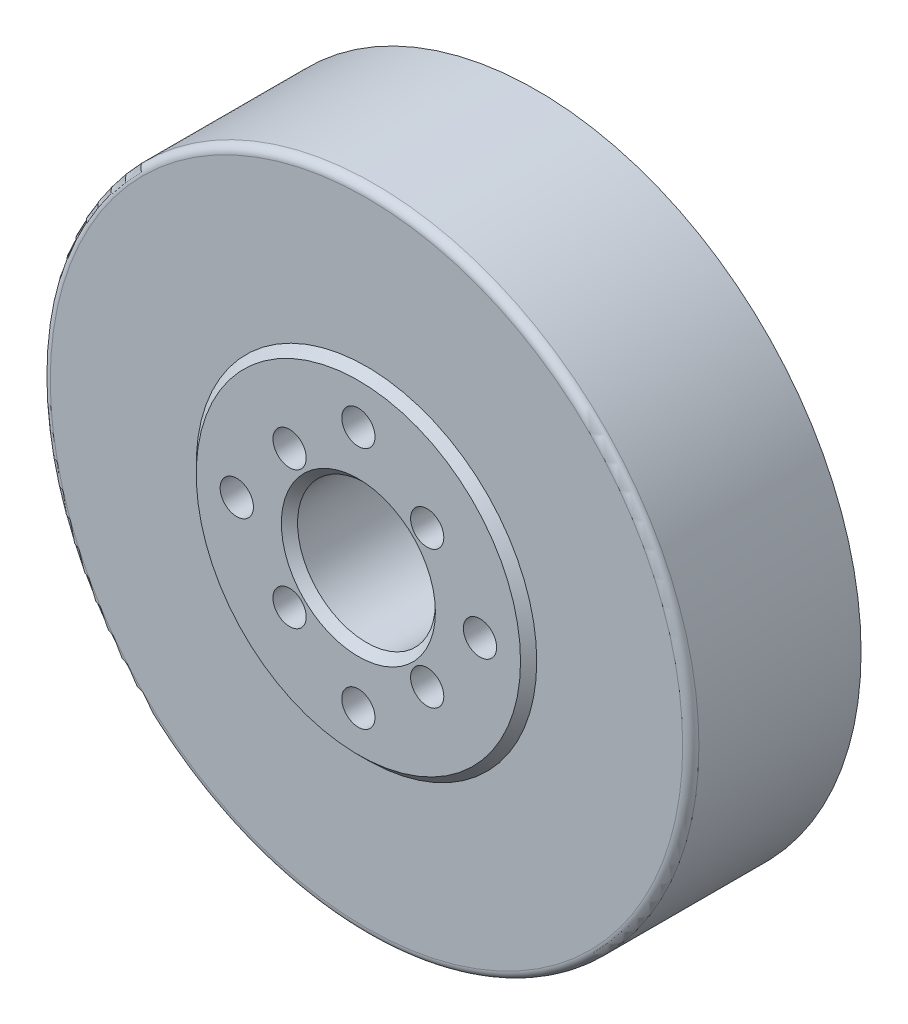
ISO-10303-21;
HEADER;
FILE_DESCRIPTION(('STEP AP214'),'2;1');
FILE_NAME('part.step','',(''),(''),'','','');
FILE_SCHEMA(('AUTOMOTIVE_DESIGN { 1 0 10303 214 1 1 1 1 }'));
ENDSEC;
DATA;
#1=APPLICATION_CONTEXT('core data for automotive mechanical design processes');
#2=APPLICATION_PROTOCOL_DEFINITION('international standard','automotive_design',2000,#1);
#3=PRODUCT_CONTEXT('',#1,'mechanical');
#4=PRODUCT('Part','Part','',(#3));
#5=PRODUCT_RELATED_PRODUCT_CATEGORY('part','',(#4));
#6=PRODUCT_DEFINITION_FORMATION('','',#4);
#7=PRODUCT_DEFINITION_CONTEXT('part definition',#1,'design');
#8=PRODUCT_DEFINITION('design','',#6,#7);
#9=PRODUCT_DEFINITION_SHAPE('','',#8);
#10=(LENGTH_UNIT() NAMED_UNIT(*) SI_UNIT(.MILLI.,.METRE.));
#11=(NAMED_UNIT(*) PLANE_ANGLE_UNIT() SI_UNIT($,.RADIAN.));
#12=(NAMED_UNIT(*) SI_UNIT($,.STERADIAN.) SOLID_ANGLE_UNIT());
#13=UNCERTAINTY_MEASURE_WITH_UNIT(LENGTH_MEASURE(1.E-05),#10,'distance_accuracy_value','');
#14=(GEOMETRIC_REPRESENTATION_CONTEXT(3) GLOBAL_UNCERTAINTY_ASSIGNED_CONTEXT((#13)) GLOBAL_UNIT_ASSIGNED_CONTEXT((#10,
#11,#12)) REPRESENTATION_CONTEXT('',''));
#15=CARTESIAN_POINT('',(0.,0.,0.));
#16=DIRECTION('',(0.,0.,1.));
#17=DIRECTION('',(1.,0.,0.));
#18=AXIS2_PLACEMENT_3D('',#15,#16,#17);
#19=CARTESIAN_POINT('',(0.,0.,10.5));
#20=DIRECTION('',(0.,0.,-1.));
#21=DIRECTION('',(-1.,0.,0.));
#22=AXIS2_PLACEMENT_3D('',#19,#20,#21);
#23=CYLINDRICAL_SURFACE('',#22,20.);
#24=CARTESIAN_POINT('',(0.,0.,10.));
#25=DIRECTION('',(0.,0.,1.));
#26=DIRECTION('',(1.,0.,0.));
#27=AXIS2_PLACEMENT_3D('',#24,#25,#26);
#28=CIRCLE('',#27,20.);
#29=CARTESIAN_POINT('',(-20.,0.,10.));
#30=VERTEX_POINT('',#29);
#31=EDGE_CURVE('E11',#30,#30,#28,.F.);
#32=CARTESIAN_POINT('',(0.,0.,0.));
#33=DIRECTION('',(0.,0.,1.));
#34=DIRECTION('',(1.,0.,0.));
#35=AXIS2_PLACEMENT_3D('',#32,#33,#34);
#36=CIRCLE('',#35,20.);
#37=CARTESIAN_POINT('',(-20.,0.,0.));
#38=VERTEX_POINT('',#37);
#39=EDGE_CURVE('E166',#38,#38,#36,.T.);
#40=CARTESIAN_POINT('',(-20.,0.,10.));
#41=CARTESIAN_POINT('',(-20.,0.,9.89583333333333));
#42=CARTESIAN_POINT('',(-20.,0.,9.79166666666667));
#43=CARTESIAN_POINT('',(-20.,0.,9.58333333333333));
#44=CARTESIAN_POINT('',(-20.,0.,9.47916666666667));
#45=CARTESIAN_POINT('',(-20.,0.,9.27083333333333));
#46=CARTESIAN_POINT('',(-20.,0.,9.16666666666667));
#47=CARTESIAN_POINT('',(-20.,0.,8.95833333333333));
#48=CARTESIAN_POINT('',(-20.,0.,8.85416666666667));
#49=CARTESIAN_POINT('',(-20.,0.,8.64583333333333));
#50=CARTESIAN_POINT('',(-20.,0.,8.54166666666667));
#51=CARTESIAN_POINT('',(-20.,0.,8.33333333333333));
#52=CARTESIAN_POINT('',(-20.,0.,8.22916666666667));
#53=CARTESIAN_POINT('',(-20.,0.,8.02083333333333));
#54=CARTESIAN_POINT('',(-20.,0.,7.91666666666667));
#55=CARTESIAN_POINT('',(-20.,0.,7.70833333333333));
#56=CARTESIAN_POINT('',(-20.,0.,7.60416666666667));
#57=CARTESIAN_POINT('',(-20.,0.,7.39583333333333));
#58=CARTESIAN_POINT('',(-20.,0.,7.29166666666667));
#59=CARTESIAN_POINT('',(-20.,0.,7.08333333333333));
#60=CARTESIAN_POINT('',(-20.,0.,6.97916666666667));
#61=CARTESIAN_POINT('',(-20.,0.,6.77083333333333));
#62=CARTESIAN_POINT('',(-20.,0.,6.66666666666667));
#63=CARTESIAN_POINT('',(-20.,0.,6.45833333333333));
#64=CARTESIAN_POINT('',(-20.,0.,6.35416666666667));
#65=CARTESIAN_POINT('',(-20.,0.,6.14583333333333));
#66=CARTESIAN_POINT('',(-20.,0.,6.04166666666667));
#67=CARTESIAN_POINT('',(-20.,0.,5.83333333333333));
#68=CARTESIAN_POINT('',(-20.,0.,5.72916666666667));
#69=CARTESIAN_POINT('',(-20.,0.,5.52083333333333));
#70=CARTESIAN_POINT('',(-20.,0.,5.41666666666667));
#71=CARTESIAN_POINT('',(-20.,0.,5.20833333333333));
#72=CARTESIAN_POINT('',(-20.,0.,5.10416666666667));
#73=CARTESIAN_POINT('',(-20.,0.,4.89583333333333));
#74=CARTESIAN_POINT('',(-20.,0.,4.79166666666667));
#75=CARTESIAN_POINT('',(-20.,0.,4.58333333333333));
#76=CARTESIAN_POINT('',(-20.,0.,4.47916666666667));
#77=CARTESIAN_POINT('',(-20.,0.,4.27083333333333));
#78=CARTESIAN_POINT('',(-20.,0.,4.16666666666667));
#79=CARTESIAN_POINT('',(-20.,0.,3.95833333333333));
#80=CARTESIAN_POINT('',(-20.,0.,3.85416666666667));
#81=CARTESIAN_POINT('',(-20.,0.,3.64583333333333));
#82=CARTESIAN_POINT('',(-20.,0.,3.54166666666667));
#83=CARTESIAN_POINT('',(-20.,0.,3.33333333333333));
#84=CARTESIAN_POINT('',(-20.,0.,3.22916666666667));
#85=CARTESIAN_POINT('',(-20.,0.,3.02083333333333));
#86=CARTESIAN_POINT('',(-20.,0.,2.91666666666667));
#87=CARTESIAN_POINT('',(-20.,0.,2.70833333333333));
#88=CARTESIAN_POINT('',(-20.,0.,2.60416666666667));
#89=CARTESIAN_POINT('',(-20.,0.,2.39583333333333));
#90=CARTESIAN_POINT('',(-20.,0.,2.29166666666667));
#91=CARTESIAN_POINT('',(-20.,0.,2.08333333333333));
#92=CARTESIAN_POINT('',(-20.,0.,1.97916666666667));
#93=CARTESIAN_POINT('',(-20.,0.,1.77083333333333));
#94=CARTESIAN_POINT('',(-20.,0.,1.66666666666666));
#95=CARTESIAN_POINT('',(-20.,0.,1.45833333333333));
#96=CARTESIAN_POINT('',(-20.,0.,1.35416666666667));
#97=CARTESIAN_POINT('',(-20.,0.,1.14583333333333));
#98=CARTESIAN_POINT('',(-20.,0.,1.04166666666667));
#99=CARTESIAN_POINT('',(-20.,0.,0.833333333333334));
#100=CARTESIAN_POINT('',(-20.,0.,0.729166666666667));
#101=CARTESIAN_POINT('',(-20.,0.,0.520833333333334));
#102=CARTESIAN_POINT('',(-20.,0.,0.416666666666667));
#103=CARTESIAN_POINT('',(-20.,0.,0.208333333333334));
#104=CARTESIAN_POINT('',(-20.,0.,0.104166666666667));
#105=CARTESIAN_POINT('',(-20.,0.,0.));
#106=B_SPLINE_CURVE_WITH_KNOTS('',3,(#40,#41,#42,#43,#44,#45,#46,#47,#48,#49,#50,#51,#52,#53,
#54,#55,#56,#57,#58,#59,#60,#61,#62,#63,#64,#65,#66,#67,#68,#69,#70,#71,#72,#73,#74,#75,#76,#77,
#78,#79,#80,#81,#82,#83,#84,#85,#86,#87,#88,#89,#90,#91,#92,#93,#94,#95,#96,#97,#98,#99,#100,
#101,#102,#103,#104,#105),.UNSPECIFIED.,.F.,.F.,(4,2,2,2,2,2,2,2,2,2,2,2,2,2,2,2,2,2,2,2,2,2,2,
2,2,2,2,2,2,2,2,2,4),(0.,0.3125,0.625000000000001,0.937500000000001,1.25,1.5625,1.875,2.1875,
2.5,2.8125,3.125,3.4375,3.75,4.0625,4.375,4.6875,5.,5.3125,5.625,5.9375,6.25,6.5625,6.875,
7.1875,7.5,7.8125,8.125,8.4375,8.75,9.0625,9.375,9.6875,10.),.UNSPECIFIED.);
#107=EDGE_CURVE('BSEAM47',#30,#38,#106,.T.);
#108=ORIENTED_EDGE('',*,*,#31,.T.);
#109=ORIENTED_EDGE('',*,*,#39,.T.);
#110=ORIENTED_EDGE('',*,*,#107,.T.);
#111=ORIENTED_EDGE('',*,*,#107,.F.);
#112=EDGE_LOOP('',(#108,#110,#109,#111));
#113=FACE_BOUND('',#112,.T.);
#114=ADVANCED_FACE('F47',(#113),#23,.T.);
#115=CARTESIAN_POINT('',(0.,0.,10.5));
#116=DIRECTION('',(0.,0.,1.));
#117=DIRECTION('',(1.,0.,0.));
#118=AXIS2_PLACEMENT_3D('',#115,#116,#117);
#119=PLANE('',#118);
#120=CARTESIAN_POINT('',(0.,0.,10.5));
#121=DIRECTION('',(0.,0.,1.));
#122=DIRECTION('',(1.,0.,0.));
#123=AXIS2_PLACEMENT_3D('',#120,#121,#122);
#124=CIRCLE('',#123,19.5);
#125=CARTESIAN_POINT('',(19.5,0.,10.5));
#126=VERTEX_POINT('',#125);
#127=EDGE_CURVE('E59',#126,#126,#124,.T.);
#128=ORIENTED_EDGE('',*,*,#127,.T.);
#129=EDGE_LOOP('',(#128));
#130=FACE_BOUND('',#129,.T.);
#131=CARTESIAN_POINT('',(0.,0.,10.5));
#132=DIRECTION('',(0.,0.,1.));
#133=DIRECTION('',(1.,0.,0.));
#134=AXIS2_PLACEMENT_3D('',#131,#132,#133);
#135=CIRCLE('',#134,10.5);
#136=CARTESIAN_POINT('',(10.5,0.,10.5));
#137=VERTEX_POINT('',#136);
#138=EDGE_CURVE('E164',#137,#137,#135,.T.);
#139=ORIENTED_EDGE('',*,*,#138,.F.);
#140=EDGE_LOOP('',(#139));
#141=FACE_BOUND('',#140,.T.);
#142=ADVANCED_FACE('F181',(#130,#141),#119,.T.);
#143=CARTESIAN_POINT('',(0.,0.,0.));
#144=DIRECTION('',(0.,0.,1.));
#145=DIRECTION('',(1.,0.,0.));
#146=AXIS2_PLACEMENT_3D('',#143,#144,#145);
#147=PLANE('',#146);
#148=CARTESIAN_POINT('',(0.,0.,0.));
#149=DIRECTION('',(0.,0.,1.));
#150=DIRECTION('',(1.,0.,0.));
#151=AXIS2_PLACEMENT_3D('',#148,#149,#150);
#152=CIRCLE('',#151,4.25);
#153=CARTESIAN_POINT('',(4.25,0.,0.));
#154=VERTEX_POINT('',#153);
#155=EDGE_CURVE('E160',#154,#154,#152,.T.);
#156=ORIENTED_EDGE('',*,*,#155,.T.);
#157=EDGE_LOOP('',(#156));
#158=FACE_BOUND('',#157,.T.);
#159=ORIENTED_EDGE('',*,*,#39,.F.);
#160=EDGE_LOOP('',(#159));
#161=FACE_BOUND('',#160,.T.);
#162=ADVANCED_FACE('F200',(#158,#161),#147,.F.);
#163=CARTESIAN_POINT('',(0.,0.,11.));
#164=DIRECTION('',(0.,0.,1.));
#165=DIRECTION('',(1.,0.,0.));
#166=AXIS2_PLACEMENT_3D('',#163,#164,#165);
#167=PLANE('',#166);
#168=CARTESIAN_POINT('',(0.,7.5,11.));
#169=DIRECTION('',(0.,0.,1.));
#170=DIRECTION('',(1.,0.,0.));
#171=AXIS2_PLACEMENT_3D('',#168,#169,#170);
#172=CIRCLE('',#171,1.02499999999999);
#173=CARTESIAN_POINT('',(1.02499999999999,7.5,11.));
#174=VERTEX_POINT('',#173);
#175=EDGE_CURVE('E92',#174,#174,#172,.T.);
#176=ORIENTED_EDGE('',*,*,#175,.F.);
#177=EDGE_LOOP('',(#176));
#178=FACE_BOUND('',#177,.T.);
#179=CARTESIAN_POINT('',(-7.5,0.,11.));
#180=DIRECTION('',(0.,0.,1.));
#181=DIRECTION('',(1.,0.,0.));
#182=AXIS2_PLACEMENT_3D('',#179,#180,#181);
#183=CIRCLE('',#182,1.02499999999999);
#184=CARTESIAN_POINT('',(-6.47500000000001,0.,11.));
#185=VERTEX_POINT('',#184);
#186=EDGE_CURVE('E94',#185,#185,#183,.T.);
#187=ORIENTED_EDGE('',*,*,#186,.F.);
#188=EDGE_LOOP('',(#187));
#189=FACE_BOUND('',#188,.T.);
#190=CARTESIAN_POINT('',(0.,-7.5,11.));
#191=DIRECTION('',(0.,0.,1.));
#192=DIRECTION('',(1.,0.,0.));
#193=AXIS2_PLACEMENT_3D('',#190,#191,#192);
#194=CIRCLE('',#193,1.02499999999999);
#195=CARTESIAN_POINT('',(1.02499999999999,-7.5,11.));
#196=VERTEX_POINT('',#195);
#197=EDGE_CURVE('E107',#196,#196,#194,.T.);
#198=ORIENTED_EDGE('',*,*,#197,.F.);
#199=EDGE_LOOP('',(#198));
#200=FACE_BOUND('',#199,.T.);
#201=CARTESIAN_POINT('',(7.5,0.,11.));
#202=DIRECTION('',(0.,0.,1.));
#203=DIRECTION('',(1.,0.,0.));
#204=AXIS2_PLACEMENT_3D('',#201,#202,#203);
#205=CIRCLE('',#204,1.02499999999999);
#206=CARTESIAN_POINT('',(8.52499999999999,0.,11.));
#207=VERTEX_POINT('',#206);
#208=EDGE_CURVE('E116',#207,#207,#205,.T.);
#209=ORIENTED_EDGE('',*,*,#208,.F.);
#210=EDGE_LOOP('',(#209));
#211=FACE_BOUND('',#210,.T.);
#212=CARTESIAN_POINT('',(4.2426406871193,-4.24264068711929,11.));
#213=DIRECTION('',(0.,0.,1.));
#214=DIRECTION('',(1.,0.,0.));
#215=AXIS2_PLACEMENT_3D('',#212,#213,#214);
#216=CIRCLE('',#215,1.02499999999999);
#217=CARTESIAN_POINT('',(5.26764068711929,-4.24264068711929,11.));
#218=VERTEX_POINT('',#217);
#219=EDGE_CURVE('E121',#218,#218,#216,.T.);
#220=ORIENTED_EDGE('',*,*,#219,.F.);
#221=EDGE_LOOP('',(#220));
#222=FACE_BOUND('',#221,.T.);
#223=CARTESIAN_POINT('',(4.24264068711929,4.2426406871193,11.));
#224=DIRECTION('',(0.,0.,1.));
#225=DIRECTION('',(1.,0.,0.));
#226=AXIS2_PLACEMENT_3D('',#223,#224,#225);
#227=CIRCLE('',#226,1.02499999999999);
#228=CARTESIAN_POINT('',(5.26764068711928,4.2426406871193,11.));
#229=VERTEX_POINT('',#228);
#230=EDGE_CURVE('E132',#229,#229,#227,.T.);
#231=ORIENTED_EDGE('',*,*,#230,.F.);
#232=EDGE_LOOP('',(#231));
#233=FACE_BOUND('',#232,.T.);
#234=CARTESIAN_POINT('',(-4.2426406871193,4.24264068711929,11.));
#235=DIRECTION('',(0.,0.,1.));
#236=DIRECTION('',(1.,0.,0.));
#237=AXIS2_PLACEMENT_3D('',#234,#235,#236);
#238=CIRCLE('',#237,1.02499999999999);
#239=CARTESIAN_POINT('',(-3.21764068711931,4.24264068711929,11.));
#240=VERTEX_POINT('',#239);
#241=EDGE_CURVE('E138',#240,#240,#238,.T.);
#242=ORIENTED_EDGE('',*,*,#241,.F.);
#243=EDGE_LOOP('',(#242));
#244=FACE_BOUND('',#243,.T.);
#245=CARTESIAN_POINT('',(-4.24264068711929,-4.2426406871193,11.));
#246=DIRECTION('',(0.,0.,1.));
#247=DIRECTION('',(1.,0.,0.));
#248=AXIS2_PLACEMENT_3D('',#245,#246,#247);
#249=CIRCLE('',#248,1.02499999999999);
#250=CARTESIAN_POINT('',(-3.2176406871193,-4.2426406871193,11.));
#251=VERTEX_POINT('',#250);
#252=EDGE_CURVE('E146',#251,#251,#249,.T.);
#253=ORIENTED_EDGE('',*,*,#252,.F.);
#254=EDGE_LOOP('',(#253));
#255=FACE_BOUND('',#254,.T.);
#256=CARTESIAN_POINT('',(0.,0.,11.));
#257=DIRECTION('',(0.,0.,1.));
#258=DIRECTION('',(1.,0.,0.));
#259=AXIS2_PLACEMENT_3D('',#256,#257,#258);
#260=CIRCLE('',#259,10.);
#261=CARTESIAN_POINT('',(10.,0.,11.));
#262=VERTEX_POINT('',#261);
#263=EDGE_CURVE('E168',#262,#262,#260,.T.);
#264=ORIENTED_EDGE('',*,*,#263,.T.);
#265=EDGE_LOOP('',(#264));
#266=FACE_BOUND('',#265,.T.);
#267=CARTESIAN_POINT('',(0.,0.,11.));
#268=DIRECTION('',(0.,0.,1.));
#269=DIRECTION('',(1.,0.,0.));
#270=AXIS2_PLACEMENT_3D('',#267,#268,#269);
#271=CIRCLE('',#270,4.75);
#272=CARTESIAN_POINT('',(4.75,0.,11.));
#273=VERTEX_POINT('',#272);
#274=EDGE_CURVE('E161',#273,#273,#271,.T.);
#275=ORIENTED_EDGE('',*,*,#274,.F.);
#276=EDGE_LOOP('',(#275));
#277=FACE_BOUND('',#276,.T.);
#278=ADVANCED_FACE('F204',(#178,#189,#200,#211,#222,#233,#244,#255,#266,#277),#167,.T.);
#279=CARTESIAN_POINT('',(0.,0.,10.5));
#280=DIRECTION('',(0.,0.,-1.));
#281=DIRECTION('',(1.,0.,0.));
#282=AXIS2_PLACEMENT_3D('',#279,#280,#281);
#283=CONICAL_SURFACE('',#282,10.5,0.785398163397449);
#284=ORIENTED_EDGE('',*,*,#263,.F.);
#285=EDGE_LOOP('',(#284));
#286=FACE_BOUND('',#285,.T.);
#287=ORIENTED_EDGE('',*,*,#138,.T.);
#288=EDGE_LOOP('',(#287));
#289=FACE_BOUND('',#288,.T.);
#290=ADVANCED_FACE('F211',(#286,#289),#283,.T.);
#291=CARTESIAN_POINT('',(0.,0.,10.5));
#292=DIRECTION('',(0.,0.,1.));
#293=DIRECTION('',(1.,0.,0.));
#294=AXIS2_PLACEMENT_3D('',#291,#292,#293);
#295=CONICAL_SURFACE('',#294,4.25,0.785398163397449);
#296=ORIENTED_EDGE('',*,*,#274,.T.);
#297=EDGE_LOOP('',(#296));
#298=FACE_BOUND('',#297,.T.);
#299=CARTESIAN_POINT('',(0.,0.,10.5));
#300=DIRECTION('',(0.,0.,1.));
#301=DIRECTION('',(1.,0.,0.));
#302=AXIS2_PLACEMENT_3D('',#299,#300,#301);
#303=CIRCLE('',#302,4.25);
#304=CARTESIAN_POINT('',(4.25,0.,10.5));
#305=VERTEX_POINT('',#304);
#306=EDGE_CURVE('E156',#305,#305,#303,.T.);
#307=ORIENTED_EDGE('',*,*,#306,.F.);
#308=EDGE_LOOP('',(#307));
#309=FACE_BOUND('',#308,.T.);
#310=ADVANCED_FACE('F210',(#298,#309),#295,.F.);
#311=CARTESIAN_POINT('',(0.,0.,0.));
#312=DIRECTION('',(0.,0.,1.));
#313=DIRECTION('',(1.,0.,0.));
#314=AXIS2_PLACEMENT_3D('',#311,#312,#313);
#315=CYLINDRICAL_SURFACE('',#314,4.25);
#316=CARTESIAN_POINT('',(4.25,0.,0.));
#317=CARTESIAN_POINT('',(4.25,0.,0.109375));
#318=CARTESIAN_POINT('',(4.25,0.,0.21875));
#319=CARTESIAN_POINT('',(4.25,0.,0.4375));
#320=CARTESIAN_POINT('',(4.25,0.,0.546875));
#321=CARTESIAN_POINT('',(4.25,0.,0.765625));
#322=CARTESIAN_POINT('',(4.25,0.,0.875));
#323=CARTESIAN_POINT('',(4.25,0.,1.09375));
#324=CARTESIAN_POINT('',(4.25,0.,1.203125));
#325=CARTESIAN_POINT('',(4.25,0.,1.421875));
#326=CARTESIAN_POINT('',(4.25,0.,1.53125));
#327=CARTESIAN_POINT('',(4.25,0.,1.75));
#328=CARTESIAN_POINT('',(4.25,0.,1.859375));
#329=CARTESIAN_POINT('',(4.25,0.,2.078125));
#330=CARTESIAN_POINT('',(4.25,0.,2.1875));
#331=CARTESIAN_POINT('',(4.25,0.,2.40625));
#332=CARTESIAN_POINT('',(4.25,0.,2.515625));
#333=CARTESIAN_POINT('',(4.25,0.,2.734375));
#334=CARTESIAN_POINT('',(4.25,0.,2.84375));
#335=CARTESIAN_POINT('',(4.25,0.,3.0625));
#336=CARTESIAN_POINT('',(4.25,0.,3.171875));
#337=CARTESIAN_POINT('',(4.25,0.,3.390625));
#338=CARTESIAN_POINT('',(4.25,0.,3.5));
#339=CARTESIAN_POINT('',(4.25,0.,3.71875));
#340=CARTESIAN_POINT('',(4.25,0.,3.828125));
#341=CARTESIAN_POINT('',(4.25,0.,4.046875));
#342=CARTESIAN_POINT('',(4.25,0.,4.15625));
#343=CARTESIAN_POINT('',(4.25,0.,4.375));
#344=CARTESIAN_POINT('',(4.25,0.,4.484375));
#345=CARTESIAN_POINT('',(4.25,0.,4.703125));
#346=CARTESIAN_POINT('',(4.25,0.,4.8125));
#347=CARTESIAN_POINT('',(4.25,0.,5.03125));
#348=CARTESIAN_POINT('',(4.25,0.,5.140625));
#349=CARTESIAN_POINT('',(4.25,0.,5.359375));
#350=CARTESIAN_POINT('',(4.25,0.,5.46875));
#351=CARTESIAN_POINT('',(4.25,0.,5.6875));
#352=CARTESIAN_POINT('',(4.25,0.,5.796875));
#353=CARTESIAN_POINT('',(4.25,0.,6.015625));
#354=CARTESIAN_POINT('',(4.25,0.,6.125));
#355=CARTESIAN_POINT('',(4.25,0.,6.34375));
#356=CARTESIAN_POINT('',(4.25,0.,6.453125));
#357=CARTESIAN_POINT('',(4.25,0.,6.671875));
#358=CARTESIAN_POINT('',(4.25,0.,6.78125));
#359=CARTESIAN_POINT('',(4.25,0.,7.));
#360=CARTESIAN_POINT('',(4.25,0.,7.109375));
#361=CARTESIAN_POINT('',(4.25,0.,7.328125));
#362=CARTESIAN_POINT('',(4.25,0.,7.4375));
#363=CARTESIAN_POINT('',(4.25,0.,7.65625));
#364=CARTESIAN_POINT('',(4.25,0.,7.765625));
#365=CARTESIAN_POINT('',(4.25,0.,7.984375));
#366=CARTESIAN_POINT('',(4.25,0.,8.09375));
#367=CARTESIAN_POINT('',(4.25,0.,8.3125));
#368=CARTESIAN_POINT('',(4.25,0.,8.421875));
#369=CARTESIAN_POINT('',(4.25,0.,8.640625));
#370=CARTESIAN_POINT('',(4.25,0.,8.75));
#371=CARTESIAN_POINT('',(4.25,0.,8.96875));
#372=CARTESIAN_POINT('',(4.25,0.,9.078125));
#373=CARTESIAN_POINT('',(4.25,0.,9.296875));
#374=CARTESIAN_POINT('',(4.25,0.,9.40625));
#375=CARTESIAN_POINT('',(4.25,0.,9.625));
#376=CARTESIAN_POINT('',(4.25,0.,9.734375));
#377=CARTESIAN_POINT('',(4.25,0.,9.953125));
#378=CARTESIAN_POINT('',(4.25,0.,10.0625));
#379=CARTESIAN_POINT('',(4.25,0.,10.28125));
#380=CARTESIAN_POINT('',(4.25,0.,10.390625));
#381=CARTESIAN_POINT('',(4.25,0.,10.5));
#382=B_SPLINE_CURVE_WITH_KNOTS('',3,(#316,#317,#318,#319,#320,#321,#322,#323,#324,#325,#326,
#327,#328,#329,#330,#331,#332,#333,#334,#335,#336,#337,#338,#339,#340,#341,#342,#343,#344,#345,
#346,#347,#348,#349,#350,#351,#352,#353,#354,#355,#356,#357,#358,#359,#360,#361,#362,#363,#364,
#365,#366,#367,#368,#369,#370,#371,#372,#373,#374,#375,#376,#377,#378,#379,#380,#381),
.UNSPECIFIED.,.F.,.F.,(4,2,2,2,2,2,2,2,2,2,2,2,2,2,2,2,2,2,2,2,2,2,2,2,2,2,2,2,2,2,2,2,4),(0.,
0.328125,0.65625,0.984375,1.3125,1.640625,1.96875,2.296875,2.625,2.953125,3.28125,3.609375,
3.9375,4.265625,4.59375,4.921875,5.25,5.578125,5.90625,6.234375,6.5625,6.890625,7.21875,
7.546875,7.875,8.203125,8.53125,8.859375,9.1875,9.515625,9.84375,10.171875,10.5),.UNSPECIFIED.);
#383=EDGE_CURVE('BSEAM209',#154,#305,#382,.T.);
#384=ORIENTED_EDGE('',*,*,#155,.F.);
#385=ORIENTED_EDGE('',*,*,#306,.T.);
#386=ORIENTED_EDGE('',*,*,#383,.T.);
#387=ORIENTED_EDGE('',*,*,#383,.F.);
#388=EDGE_LOOP('',(#384,#386,#385,#387));
#389=FACE_BOUND('',#388,.T.);
#390=ADVANCED_FACE('F209',(#389),#315,.F.);
#391=CARTESIAN_POINT('',(-4.24264068711929,-4.2426406871193,6.61588213450325));
#392=DIRECTION('',(0.,0.,1.));
#393=DIRECTION('',(1.,0.,0.));
#394=AXIS2_PLACEMENT_3D('',#391,#392,#393);
#395=CONICAL_SURFACE('',#394,1.025,1.02974425867665);
#396=CARTESIAN_POINT('',(-4.24264068711929,-4.2426406871193,6.));
#397=VERTEX_POINT('',#396);
#398=VERTEX_LOOP('',#397);
#399=FACE_BOUND('',#398,.T.);
#400=CARTESIAN_POINT('',(-4.24264068711929,-4.2426406871193,6.61588213450325));
#401=DIRECTION('',(0.,0.,1.));
#402=DIRECTION('',(1.,0.,0.));
#403=AXIS2_PLACEMENT_3D('',#400,#401,#402);
#404=CIRCLE('',#403,1.025);
#405=CARTESIAN_POINT('',(-3.21764068711929,-4.2426406871193,6.61588213450325));
#406=VERTEX_POINT('',#405);
#407=EDGE_CURVE('E155',#406,#406,#404,.T.);
#408=ORIENTED_EDGE('',*,*,#407,.T.);
#409=EDGE_LOOP('',(#408));
#410=FACE_BOUND('',#409,.T.);
#411=ADVANCED_FACE('F222',(#399,#410),#395,.F.);
#412=CARTESIAN_POINT('',(-4.24264068711929,-4.2426406871193,11.));
#413=DIRECTION('',(0.,0.,1.));
#414=DIRECTION('',(1.,0.,0.));
#415=AXIS2_PLACEMENT_3D('',#412,#413,#414);
#416=CYLINDRICAL_SURFACE('',#415,1.02499999999999);
#417=ORIENTED_EDGE('',*,*,#407,.F.);
#418=EDGE_LOOP('',(#417));
#419=FACE_BOUND('',#418,.T.);
#420=ORIENTED_EDGE('',*,*,#252,.T.);
#421=EDGE_LOOP('',(#420));
#422=FACE_BOUND('',#421,.T.);
#423=ADVANCED_FACE('F223',(#419,#422),#416,.F.);
#424=CARTESIAN_POINT('',(-4.2426406871193,4.24264068711929,6.61588213450325));
#425=DIRECTION('',(0.,0.,1.));
#426=DIRECTION('',(1.,0.,0.));
#427=AXIS2_PLACEMENT_3D('',#424,#425,#426);
#428=CONICAL_SURFACE('',#427,1.025,1.02974425867665);
#429=CARTESIAN_POINT('',(-4.2426406871193,4.24264068711929,6.));
#430=VERTEX_POINT('',#429);
#431=VERTEX_LOOP('',#430);
#432=FACE_BOUND('',#431,.T.);
#433=CARTESIAN_POINT('',(-4.2426406871193,4.24264068711929,6.61588213450325));
#434=DIRECTION('',(0.,0.,1.));
#435=DIRECTION('',(1.,0.,0.));
#436=AXIS2_PLACEMENT_3D('',#433,#434,#435);
#437=CIRCLE('',#436,1.025);
#438=CARTESIAN_POINT('',(-3.2176406871193,4.24264068711929,6.61588213450325));
#439=VERTEX_POINT('',#438);
#440=EDGE_CURVE('E145',#439,#439,#437,.T.);
#441=ORIENTED_EDGE('',*,*,#440,.T.);
#442=EDGE_LOOP('',(#441));
#443=FACE_BOUND('',#442,.T.);
#444=ADVANCED_FACE('F229',(#432,#443),#428,.F.);
#445=CARTESIAN_POINT('',(-4.2426406871193,4.24264068711929,11.));
#446=DIRECTION('',(0.,0.,1.));
#447=DIRECTION('',(1.,0.,0.));
#448=AXIS2_PLACEMENT_3D('',#445,#446,#447);
#449=CYLINDRICAL_SURFACE('',#448,1.02499999999999);
#450=ORIENTED_EDGE('',*,*,#440,.F.);
#451=EDGE_LOOP('',(#450));
#452=FACE_BOUND('',#451,.T.);
#453=ORIENTED_EDGE('',*,*,#241,.T.);
#454=EDGE_LOOP('',(#453));
#455=FACE_BOUND('',#454,.T.);
#456=ADVANCED_FACE('F235',(#452,#455),#449,.F.);
#457=CARTESIAN_POINT('',(4.24264068711929,4.2426406871193,6.61588213450325));
#458=DIRECTION('',(0.,0.,1.));
#459=DIRECTION('',(1.,0.,0.));
#460=AXIS2_PLACEMENT_3D('',#457,#458,#459);
#461=CONICAL_SURFACE('',#460,1.025,1.02974425867665);
#462=CARTESIAN_POINT('',(4.24264068711928,4.2426406871193,6.));
#463=VERTEX_POINT('',#462);
#464=VERTEX_LOOP('',#463);
#465=FACE_BOUND('',#464,.T.);
#466=CARTESIAN_POINT('',(4.24264068711929,4.2426406871193,6.61588213450325));
#467=DIRECTION('',(0.,0.,1.));
#468=DIRECTION('',(1.,0.,0.));
#469=AXIS2_PLACEMENT_3D('',#466,#467,#468);
#470=CIRCLE('',#469,1.025);
#471=CARTESIAN_POINT('',(5.26764068711928,4.2426406871193,6.61588213450325));
#472=VERTEX_POINT('',#471);
#473=EDGE_CURVE('E137',#472,#472,#470,.T.);
#474=ORIENTED_EDGE('',*,*,#473,.T.);
#475=EDGE_LOOP('',(#474));
#476=FACE_BOUND('',#475,.T.);
#477=ADVANCED_FACE('F233',(#465,#476),#461,.F.);
#478=CARTESIAN_POINT('',(4.24264068711929,4.2426406871193,11.));
#479=DIRECTION('',(0.,0.,1.));
#480=DIRECTION('',(1.,0.,0.));
#481=AXIS2_PLACEMENT_3D('',#478,#479,#480);
#482=CYLINDRICAL_SURFACE('',#481,1.02499999999999);
#483=ORIENTED_EDGE('',*,*,#473,.F.);
#484=EDGE_LOOP('',(#483));
#485=FACE_BOUND('',#484,.T.);
#486=ORIENTED_EDGE('',*,*,#230,.T.);
#487=EDGE_LOOP('',(#486));
#488=FACE_BOUND('',#487,.T.);
#489=ADVANCED_FACE('F239',(#485,#488),#482,.F.);
#490=CARTESIAN_POINT('',(4.2426406871193,-4.24264068711929,6.61588213450325));
#491=DIRECTION('',(0.,0.,1.));
#492=DIRECTION('',(1.,0.,0.));
#493=AXIS2_PLACEMENT_3D('',#490,#491,#492);
#494=CONICAL_SURFACE('',#493,1.025,1.02974425867665);
#495=CARTESIAN_POINT('',(4.2426406871193,-4.24264068711929,6.));
#496=VERTEX_POINT('',#495);
#497=VERTEX_LOOP('',#496);
#498=FACE_BOUND('',#497,.T.);
#499=CARTESIAN_POINT('',(4.2426406871193,-4.24264068711929,6.61588213450325));
#500=DIRECTION('',(0.,0.,1.));
#501=DIRECTION('',(1.,0.,0.));
#502=AXIS2_PLACEMENT_3D('',#499,#500,#501);
#503=CIRCLE('',#502,1.025);
#504=CARTESIAN_POINT('',(5.2676406871193,-4.24264068711929,6.61588213450325));
#505=VERTEX_POINT('',#504);
#506=EDGE_CURVE('E126',#505,#505,#503,.T.);
#507=ORIENTED_EDGE('',*,*,#506,.T.);
#508=EDGE_LOOP('',(#507));
#509=FACE_BOUND('',#508,.T.);
#510=ADVANCED_FACE('F244',(#498,#509),#494,.F.);
#511=CARTESIAN_POINT('',(4.2426406871193,-4.24264068711929,11.));
#512=DIRECTION('',(0.,0.,1.));
#513=DIRECTION('',(1.,0.,0.));
#514=AXIS2_PLACEMENT_3D('',#511,#512,#513);
#515=CYLINDRICAL_SURFACE('',#514,1.02499999999999);
#516=ORIENTED_EDGE('',*,*,#506,.F.);
#517=EDGE_LOOP('',(#516));
#518=FACE_BOUND('',#517,.T.);
#519=ORIENTED_EDGE('',*,*,#219,.T.);
#520=EDGE_LOOP('',(#519));
#521=FACE_BOUND('',#520,.T.);
#522=ADVANCED_FACE('F250',(#518,#521),#515,.F.);
#523=CARTESIAN_POINT('',(7.5,0.,6.61588213450325));
#524=DIRECTION('',(0.,0.,1.));
#525=DIRECTION('',(1.,0.,0.));
#526=AXIS2_PLACEMENT_3D('',#523,#524,#525);
#527=CONICAL_SURFACE('',#526,1.025,1.02974425867665);
#528=CARTESIAN_POINT('',(7.5,0.,6.));
#529=VERTEX_POINT('',#528);
#530=VERTEX_LOOP('',#529);
#531=FACE_BOUND('',#530,.T.);
#532=CARTESIAN_POINT('',(7.5,0.,6.61588213450325));
#533=DIRECTION('',(0.,0.,1.));
#534=DIRECTION('',(1.,0.,0.));
#535=AXIS2_PLACEMENT_3D('',#532,#533,#534);
#536=CIRCLE('',#535,1.025);
#537=CARTESIAN_POINT('',(8.525,0.,6.61588213450325));
#538=VERTEX_POINT('',#537);
#539=EDGE_CURVE('E120',#538,#538,#536,.T.);
#540=ORIENTED_EDGE('',*,*,#539,.T.);
#541=EDGE_LOOP('',(#540));
#542=FACE_BOUND('',#541,.T.);
#543=ADVANCED_FACE('F253',(#531,#542),#527,.F.);
#544=CARTESIAN_POINT('',(7.5,0.,11.));
#545=DIRECTION('',(0.,0.,1.));
#546=DIRECTION('',(1.,0.,0.));
#547=AXIS2_PLACEMENT_3D('',#544,#545,#546);
#548=CYLINDRICAL_SURFACE('',#547,1.02499999999999);
#549=ORIENTED_EDGE('',*,*,#539,.F.);
#550=EDGE_LOOP('',(#549));
#551=FACE_BOUND('',#550,.T.);
#552=ORIENTED_EDGE('',*,*,#208,.T.);
#553=EDGE_LOOP('',(#552));
#554=FACE_BOUND('',#553,.T.);
#555=ADVANCED_FACE('F254',(#551,#554),#548,.F.);
#556=CARTESIAN_POINT('',(0.,-7.5,6.61588213450325));
#557=DIRECTION('',(0.,0.,1.));
#558=DIRECTION('',(1.,0.,0.));
#559=AXIS2_PLACEMENT_3D('',#556,#557,#558);
#560=CONICAL_SURFACE('',#559,1.025,1.02974425867665);
#561=CARTESIAN_POINT('',(0.,-7.5,6.));
#562=VERTEX_POINT('',#561);
#563=VERTEX_LOOP('',#562);
#564=FACE_BOUND('',#563,.T.);
#565=CARTESIAN_POINT('',(0.,-7.5,6.61588213450325));
#566=DIRECTION('',(0.,0.,1.));
#567=DIRECTION('',(1.,0.,0.));
#568=AXIS2_PLACEMENT_3D('',#565,#566,#567);
#569=CIRCLE('',#568,1.025);
#570=CARTESIAN_POINT('',(1.025,-7.5,6.61588213450325));
#571=VERTEX_POINT('',#570);
#572=EDGE_CURVE('E115',#571,#571,#569,.T.);
#573=ORIENTED_EDGE('',*,*,#572,.T.);
#574=EDGE_LOOP('',(#573));
#575=FACE_BOUND('',#574,.T.);
#576=ADVANCED_FACE('F259',(#564,#575),#560,.F.);
#577=CARTESIAN_POINT('',(0.,-7.5,11.));
#578=DIRECTION('',(0.,0.,1.));
#579=DIRECTION('',(1.,0.,0.));
#580=AXIS2_PLACEMENT_3D('',#577,#578,#579);
#581=CYLINDRICAL_SURFACE('',#580,1.02499999999999);
#582=ORIENTED_EDGE('',*,*,#572,.F.);
#583=EDGE_LOOP('',(#582));
#584=FACE_BOUND('',#583,.T.);
#585=ORIENTED_EDGE('',*,*,#197,.T.);
#586=EDGE_LOOP('',(#585));
#587=FACE_BOUND('',#586,.T.);
#588=ADVANCED_FACE('F263',(#584,#587),#581,.F.);
#589=CARTESIAN_POINT('',(-7.5,0.,6.61588213450325));
#590=DIRECTION('',(0.,0.,1.));
#591=DIRECTION('',(1.,0.,0.));
#592=AXIS2_PLACEMENT_3D('',#589,#590,#591);
#593=CONICAL_SURFACE('',#592,1.025,1.02974425867665);
#594=CARTESIAN_POINT('',(-7.5,0.,6.));
#595=VERTEX_POINT('',#594);
#596=VERTEX_LOOP('',#595);
#597=FACE_BOUND('',#596,.T.);
#598=CARTESIAN_POINT('',(-7.5,0.,6.61588213450325));
#599=DIRECTION('',(0.,0.,1.));
#600=DIRECTION('',(1.,0.,0.));
#601=AXIS2_PLACEMENT_3D('',#598,#599,#600);
#602=CIRCLE('',#601,1.025);
#603=CARTESIAN_POINT('',(-6.475,0.,6.61588213450325));
#604=VERTEX_POINT('',#603);
#605=EDGE_CURVE('E99',#604,#604,#602,.T.);
#606=ORIENTED_EDGE('',*,*,#605,.T.);
#607=EDGE_LOOP('',(#606));
#608=FACE_BOUND('',#607,.T.);
#609=ADVANCED_FACE('F270',(#597,#608),#593,.F.);
#610=CARTESIAN_POINT('',(-7.5,0.,11.));
#611=DIRECTION('',(0.,0.,1.));
#612=DIRECTION('',(1.,0.,0.));
#613=AXIS2_PLACEMENT_3D('',#610,#611,#612);
#614=CYLINDRICAL_SURFACE('',#613,1.02499999999999);
#615=ORIENTED_EDGE('',*,*,#605,.F.);
#616=EDGE_LOOP('',(#615));
#617=FACE_BOUND('',#616,.T.);
#618=ORIENTED_EDGE('',*,*,#186,.T.);
#619=EDGE_LOOP('',(#618));
#620=FACE_BOUND('',#619,.T.);
#621=ADVANCED_FACE('F87',(#617,#620),#614,.F.);
#622=CARTESIAN_POINT('',(0.,7.5,6.61588213450325));
#623=DIRECTION('',(0.,0.,1.));
#624=DIRECTION('',(1.,0.,0.));
#625=AXIS2_PLACEMENT_3D('',#622,#623,#624);
#626=CONICAL_SURFACE('',#625,1.025,1.02974425867665);
#627=CARTESIAN_POINT('',(0.,7.5,6.));
#628=VERTEX_POINT('',#627);
#629=VERTEX_LOOP('',#628);
#630=FACE_BOUND('',#629,.T.);
#631=CARTESIAN_POINT('',(0.,7.5,6.61588213450325));
#632=DIRECTION('',(0.,0.,1.));
#633=DIRECTION('',(1.,0.,0.));
#634=AXIS2_PLACEMENT_3D('',#631,#632,#633);
#635=CIRCLE('',#634,1.025);
#636=CARTESIAN_POINT('',(1.025,7.5,6.61588213450325));
#637=VERTEX_POINT('',#636);
#638=EDGE_CURVE('E93',#637,#637,#635,.T.);
#639=ORIENTED_EDGE('',*,*,#638,.T.);
#640=EDGE_LOOP('',(#639));
#641=FACE_BOUND('',#640,.T.);
#642=ADVANCED_FACE('F84',(#630,#641),#626,.F.);
#643=CARTESIAN_POINT('',(0.,7.5,11.));
#644=DIRECTION('',(0.,0.,1.));
#645=DIRECTION('',(1.,0.,0.));
#646=AXIS2_PLACEMENT_3D('',#643,#644,#645);
#647=CYLINDRICAL_SURFACE('',#646,1.02499999999999);
#648=ORIENTED_EDGE('',*,*,#638,.F.);
#649=EDGE_LOOP('',(#648));
#650=FACE_BOUND('',#649,.T.);
#651=ORIENTED_EDGE('',*,*,#175,.T.);
#652=EDGE_LOOP('',(#651));
#653=FACE_BOUND('',#652,.T.);
#654=ADVANCED_FACE('F88',(#650,#653),#647,.F.);
#655=CARTESIAN_POINT('',(0.,0.,10.));
#656=DIRECTION('',(0.,0.,1.));
#657=DIRECTION('',(1.,0.,0.));
#658=AXIS2_PLACEMENT_3D('',#655,#656,#657);
#659=TOROIDAL_SURFACE('',#658,19.5,0.5);
#660=ORIENTED_EDGE('',*,*,#31,.F.);
#661=EDGE_LOOP('',(#660));
#662=FACE_BOUND('',#661,.T.);
#663=ORIENTED_EDGE('',*,*,#127,.F.);
#664=EDGE_LOOP('',(#663));
#665=FACE_BOUND('',#664,.T.);
#666=ADVANCED_FACE('F51',(#662,#665),#659,.T.);
#667=CLOSED_SHELL('',(#114,#142,#162,#278,#290,#310,#390,#411,#423,#444,#456,#477,#489,#510,
#522,#543,#555,#576,#588,#609,#621,#642,#654,#666));
#668=MANIFOLD_SOLID_BREP('B2',#667);
#669=ADVANCED_BREP_SHAPE_REPRESENTATION('',(#18,#668),#14);
#670=SHAPE_DEFINITION_REPRESENTATION(#9,#669);
ENDSEC;
END-ISO-10303-21;
